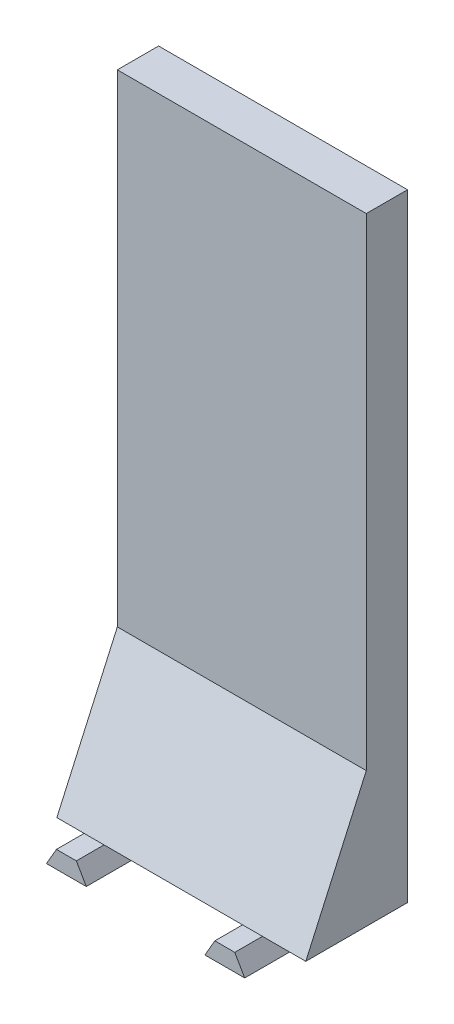
ISO-10303-21;
HEADER;
FILE_DESCRIPTION(('STEP AP214'),'2;1');
FILE_NAME('part.step','',(''),(''),'','','');
FILE_SCHEMA(('AUTOMOTIVE_DESIGN { 1 0 10303 214 1 1 1 1 }'));
ENDSEC;
DATA;
#1=APPLICATION_CONTEXT('core data for automotive mechanical design processes');
#2=APPLICATION_PROTOCOL_DEFINITION('international standard','automotive_design',2000,#1);
#3=PRODUCT_CONTEXT('',#1,'mechanical');
#4=PRODUCT('Part','Part','',(#3));
#5=PRODUCT_RELATED_PRODUCT_CATEGORY('part','',(#4));
#6=PRODUCT_DEFINITION_FORMATION('','',#4);
#7=PRODUCT_DEFINITION_CONTEXT('part definition',#1,'design');
#8=PRODUCT_DEFINITION('design','',#6,#7);
#9=PRODUCT_DEFINITION_SHAPE('','',#8);
#10=(LENGTH_UNIT() NAMED_UNIT(*) SI_UNIT(.MILLI.,.METRE.));
#11=(NAMED_UNIT(*) PLANE_ANGLE_UNIT() SI_UNIT($,.RADIAN.));
#12=(NAMED_UNIT(*) SI_UNIT($,.STERADIAN.) SOLID_ANGLE_UNIT());
#13=UNCERTAINTY_MEASURE_WITH_UNIT(LENGTH_MEASURE(1.E-05),#10,'distance_accuracy_value','');
#14=(GEOMETRIC_REPRESENTATION_CONTEXT(3) GLOBAL_UNCERTAINTY_ASSIGNED_CONTEXT((#13)) GLOBAL_UNIT_ASSIGNED_CONTEXT((#10,
#11,#12)) REPRESENTATION_CONTEXT('',''));
#15=CARTESIAN_POINT('',(0.,0.,0.));
#16=DIRECTION('',(0.,0.,1.));
#17=DIRECTION('',(1.,0.,0.));
#18=AXIS2_PLACEMENT_3D('',#15,#16,#17);
#19=CARTESIAN_POINT('',(694.20561018038,896.138718146704,5.));
#20=DIRECTION('',(0.,-1.,0.));
#21=DIRECTION('',(0.,0.,-1.));
#22=AXIS2_PLACEMENT_3D('',#19,#20,#21);
#23=PLANE('',#22);
#24=DIRECTION('',(1.,0.,0.));
#25=VECTOR('',#24,1.);
#26=CARTESIAN_POINT('',(694.20561018038,896.138718146704,20.));
#27=LINE('',#26,#25);
#28=CARTESIAN_POINT('',(694.20561018038,896.138718146704,20.));
#29=VERTEX_POINT('',#28);
#30=CARTESIAN_POINT('',(698.205610180381,896.138718146704,20.));
#31=VERTEX_POINT('',#30);
#32=EDGE_CURVE('E148',#29,#31,#27,.T.);
#33=ORIENTED_EDGE('',*,*,#32,.F.);
#34=DIRECTION('',(0.,0.,1.));
#35=VECTOR('',#34,1.);
#36=CARTESIAN_POINT('',(694.20561018038,896.138718146704,5.));
#37=LINE('',#36,#35);
#38=CARTESIAN_POINT('',(694.20561018038,896.138718146704,5.));
#39=VERTEX_POINT('',#38);
#40=EDGE_CURVE('E96',#39,#29,#37,.T.);
#41=ORIENTED_EDGE('',*,*,#40,.F.);
#42=DIRECTION('',(1.,0.,0.));
#43=VECTOR('',#42,1.);
#44=CARTESIAN_POINT('',(694.20561018038,896.138718146704,5.));
#45=LINE('',#44,#43);
#46=CARTESIAN_POINT('',(698.205610180381,896.138718146704,5.));
#47=VERTEX_POINT('',#46);
#48=EDGE_CURVE('E142',#39,#47,#45,.T.);
#49=ORIENTED_EDGE('',*,*,#48,.T.);
#50=DIRECTION('',(0.,0.,1.));
#51=VECTOR('',#50,1.);
#52=CARTESIAN_POINT('',(698.205610180381,896.138718146704,5.));
#53=LINE('',#52,#51);
#54=EDGE_CURVE('E76',#47,#31,#53,.T.);
#55=ORIENTED_EDGE('',*,*,#54,.T.);
#56=EDGE_LOOP('',(#33,#41,#49,#55));
#57=FACE_BOUND('',#56,.T.);
#58=ADVANCED_FACE('F52',(#57),#23,.T.);
#59=CARTESIAN_POINT('',(695.20561018038,897.870768954272,5.));
#60=DIRECTION('',(-0.866025403784439,0.499999999999998,0.));
#61=DIRECTION('',(-0.499999999999999,-0.86602540378444,0.));
#62=AXIS2_PLACEMENT_3D('',#59,#60,#61);
#63=PLANE('',#62);
#64=DIRECTION('',(0.499999999999999,0.86602540378444,0.));
#65=VECTOR('',#64,1.);
#66=CARTESIAN_POINT('',(695.20561018038,897.870768954272,7.));
#67=LINE('',#66,#65);
#68=CARTESIAN_POINT('',(695.200250037747,897.861484914896,7.));
#69=VERTEX_POINT('',#68);
#70=CARTESIAN_POINT('',(695.20561018038,897.870768954272,7.));
#71=VERTEX_POINT('',#70);
#72=EDGE_CURVE('E129',#69,#71,#67,.T.);
#73=ORIENTED_EDGE('',*,*,#72,.F.);
#74=DIRECTION('',(0.,0.,1.));
#75=VECTOR('',#74,1.);
#76=CARTESIAN_POINT('',(695.200250037747,897.861484914896,5.));
#77=LINE('',#76,#75);
#78=CARTESIAN_POINT('',(695.200250037747,897.861484914896,5.));
#79=VERTEX_POINT('',#78);
#80=EDGE_CURVE('E121',#79,#69,#77,.T.);
#81=ORIENTED_EDGE('',*,*,#80,.F.);
#82=DIRECTION('',(-0.499999999999998,-0.866025403784439,0.));
#83=VECTOR('',#82,1.);
#84=CARTESIAN_POINT('',(695.20561018038,897.870768954272,5.));
#85=LINE('',#84,#83);
#86=EDGE_CURVE('E132',#79,#39,#85,.T.);
#87=ORIENTED_EDGE('',*,*,#86,.T.);
#88=ORIENTED_EDGE('',*,*,#40,.T.);
#89=DIRECTION('',(-0.499999999999998,-0.866025403784439,0.));
#90=VECTOR('',#89,1.);
#91=CARTESIAN_POINT('',(695.20561018038,897.870768954272,20.));
#92=LINE('',#91,#90);
#93=CARTESIAN_POINT('',(695.20561018038,897.870768954272,20.));
#94=VERTEX_POINT('',#93);
#95=EDGE_CURVE('E138',#94,#29,#92,.T.);
#96=ORIENTED_EDGE('',*,*,#95,.F.);
#97=DIRECTION('',(0.,0.,1.));
#98=VECTOR('',#97,1.);
#99=CARTESIAN_POINT('',(695.20561018038,897.870768954272,5.));
#100=LINE('',#99,#98);
#101=EDGE_CURVE('E135',#71,#94,#100,.T.);
#102=ORIENTED_EDGE('',*,*,#101,.F.);
#103=EDGE_LOOP('',(#73,#81,#87,#88,#96,#102));
#104=FACE_BOUND('',#103,.T.);
#105=ADVANCED_FACE('F156',(#104),#63,.T.);
#106=CARTESIAN_POINT('',(697.20561018038,897.870768954272,5.));
#107=DIRECTION('',(0.,1.,0.));
#108=DIRECTION('',(0.,0.,1.));
#109=AXIS2_PLACEMENT_3D('',#106,#107,#108);
#110=PLANE('',#109);
#111=DIRECTION('',(1.,0.,0.));
#112=VECTOR('',#111,1.);
#113=CARTESIAN_POINT('',(697.20561018038,897.870768954272,7.));
#114=LINE('',#113,#112);
#115=CARTESIAN_POINT('',(697.20561018038,897.870768954272,7.));
#116=VERTEX_POINT('',#115);
#117=EDGE_CURVE('E117',#71,#116,#114,.T.);
#118=ORIENTED_EDGE('',*,*,#117,.F.);
#119=ORIENTED_EDGE('',*,*,#101,.T.);
#120=DIRECTION('',(-1.,0.,0.));
#121=VECTOR('',#120,1.);
#122=CARTESIAN_POINT('',(697.20561018038,897.870768954272,20.));
#123=LINE('',#122,#121);
#124=CARTESIAN_POINT('',(697.20561018038,897.870768954272,20.));
#125=VERTEX_POINT('',#124);
#126=EDGE_CURVE('E141',#125,#94,#123,.T.);
#127=ORIENTED_EDGE('',*,*,#126,.F.);
#128=DIRECTION('',(0.,0.,1.));
#129=VECTOR('',#128,1.);
#130=CARTESIAN_POINT('',(697.20561018038,897.870768954272,5.));
#131=LINE('',#130,#129);
#132=EDGE_CURVE('E133',#116,#125,#131,.T.);
#133=ORIENTED_EDGE('',*,*,#132,.F.);
#134=EDGE_LOOP('',(#118,#119,#127,#133));
#135=FACE_BOUND('',#134,.T.);
#136=ADVANCED_FACE('F159',(#135),#110,.T.);
#137=CARTESIAN_POINT('',(698.205610180381,896.138718146704,5.));
#138=DIRECTION('',(0.866025403784416,0.50000000000004,0.));
#139=DIRECTION('',(-0.50000000000004,0.866025403784416,0.));
#140=AXIS2_PLACEMENT_3D('',#137,#138,#139);
#141=PLANE('',#140);
#142=DIRECTION('',(0.50000000000004,-0.866025403784416,0.));
#143=VECTOR('',#142,1.);
#144=CARTESIAN_POINT('',(698.205610180381,896.138718146704,7.));
#145=LINE('',#144,#143);
#146=CARTESIAN_POINT('',(697.210970323013,897.861484914896,7.));
#147=VERTEX_POINT('',#146);
#148=EDGE_CURVE('E12',#116,#147,#145,.T.);
#149=ORIENTED_EDGE('',*,*,#148,.F.);
#150=ORIENTED_EDGE('',*,*,#132,.T.);
#151=DIRECTION('',(-0.50000000000004,0.866025403784415,0.));
#152=VECTOR('',#151,1.);
#153=CARTESIAN_POINT('',(698.205610180381,896.138718146704,20.));
#154=LINE('',#153,#152);
#155=EDGE_CURVE('E145',#31,#125,#154,.T.);
#156=ORIENTED_EDGE('',*,*,#155,.F.);
#157=ORIENTED_EDGE('',*,*,#54,.F.);
#158=DIRECTION('',(-0.50000000000004,0.866025403784415,0.));
#159=VECTOR('',#158,1.);
#160=CARTESIAN_POINT('',(698.205610180381,896.138718146704,5.));
#161=LINE('',#160,#159);
#162=CARTESIAN_POINT('',(697.210970323013,897.861484914896,5.));
#163=VERTEX_POINT('',#162);
#164=EDGE_CURVE('E124',#47,#163,#161,.T.);
#165=ORIENTED_EDGE('',*,*,#164,.T.);
#166=DIRECTION('',(0.,0.,-1.));
#167=VECTOR('',#166,1.);
#168=CARTESIAN_POINT('',(697.210970323013,897.861484914896,5.));
#169=LINE('',#168,#167);
#170=EDGE_CURVE('E67',#147,#163,#169,.T.);
#171=ORIENTED_EDGE('',*,*,#170,.F.);
#172=EDGE_LOOP('',(#149,#150,#156,#157,#165,#171));
#173=FACE_BOUND('',#172,.T.);
#174=ADVANCED_FACE('F123',(#173),#141,.T.);
#175=CARTESIAN_POINT('',(0.,0.,5.));
#176=DIRECTION('',(0.,0.,1.));
#177=DIRECTION('',(1.,0.,0.));
#178=AXIS2_PLACEMENT_3D('',#175,#176,#177);
#179=PLANE('',#178);
#180=ORIENTED_EDGE('',*,*,#86,.F.);
#181=DIRECTION('',(1.,0.,0.));
#182=VECTOR('',#181,1.);
#183=CARTESIAN_POINT('',(0.,897.861484914896,5.));
#184=LINE('',#183,#182);
#185=EDGE_CURVE('E60',#79,#163,#184,.T.);
#186=ORIENTED_EDGE('',*,*,#185,.T.);
#187=ORIENTED_EDGE('',*,*,#164,.F.);
#188=ORIENTED_EDGE('',*,*,#48,.F.);
#189=EDGE_LOOP('',(#180,#186,#187,#188));
#190=FACE_BOUND('',#189,.T.);
#191=ADVANCED_FACE('F54',(#190),#179,.F.);
#192=CARTESIAN_POINT('',(0.,0.,20.));
#193=DIRECTION('',(0.,0.,1.));
#194=DIRECTION('',(1.,0.,0.));
#195=AXIS2_PLACEMENT_3D('',#192,#193,#194);
#196=PLANE('',#195);
#197=ORIENTED_EDGE('',*,*,#32,.T.);
#198=ORIENTED_EDGE('',*,*,#155,.T.);
#199=ORIENTED_EDGE('',*,*,#126,.T.);
#200=ORIENTED_EDGE('',*,*,#95,.T.);
#201=EDGE_LOOP('',(#197,#198,#199,#200));
#202=FACE_BOUND('',#201,.T.);
#203=ADVANCED_FACE('F162',(#202),#196,.T.);
#204=CARTESIAN_POINT('',(701.556165530327,899.870768954272,7.));
#205=DIRECTION('',(0.,0.,1.));
#206=DIRECTION('',(1.,0.,0.));
#207=AXIS2_PLACEMENT_3D('',#204,#205,#206);
#208=PLANE('',#207);
#209=ORIENTED_EDGE('',*,*,#72,.T.);
#210=ORIENTED_EDGE('',*,*,#117,.T.);
#211=ORIENTED_EDGE('',*,*,#148,.T.);
#212=DIRECTION('',(-1.,0.,0.));
#213=VECTOR('',#212,1.);
#214=CARTESIAN_POINT('',(701.556165530327,897.861484914896,7.));
#215=LINE('',#214,#213);
#216=EDGE_CURVE('E114',#147,#69,#215,.T.);
#217=ORIENTED_EDGE('',*,*,#216,.T.);
#218=EDGE_LOOP('',(#209,#210,#211,#217));
#219=FACE_BOUND('',#218,.T.);
#220=ADVANCED_FACE('F113',(#219),#208,.F.);
#221=CARTESIAN_POINT('',(701.556165530327,897.861484914896,0.));
#222=DIRECTION('',(0.,-1.,0.));
#223=DIRECTION('',(0.,0.,-1.));
#224=AXIS2_PLACEMENT_3D('',#221,#222,#223);
#225=PLANE('',#224);
#226=ORIENTED_EDGE('',*,*,#80,.T.);
#227=ORIENTED_EDGE('',*,*,#216,.F.);
#228=ORIENTED_EDGE('',*,*,#170,.T.);
#229=ORIENTED_EDGE('',*,*,#185,.F.);
#230=EDGE_LOOP('',(#226,#227,#228,#229));
#231=FACE_BOUND('',#230,.T.);
#232=ADVANCED_FACE('F119',(#231),#225,.F.);
#233=CLOSED_SHELL('',(#58,#105,#136,#174,#191,#203,#220,#232));
#234=MANIFOLD_SOLID_BREP('B2',#233);
#235=CARTESIAN_POINT('',(681.296852934828,897.870768954272,5.));
#236=DIRECTION('',(0.,1.,0.));
#237=DIRECTION('',(0.,0.,1.));
#238=AXIS2_PLACEMENT_3D('',#235,#236,#237);
#239=PLANE('',#238);
#240=DIRECTION('',(1.,0.,0.));
#241=VECTOR('',#240,1.);
#242=CARTESIAN_POINT('',(681.296852934828,897.870768954272,7.));
#243=LINE('',#242,#241);
#244=CARTESIAN_POINT('',(679.296852934828,897.870768954272,7.));
#245=VERTEX_POINT('',#244);
#246=CARTESIAN_POINT('',(681.296852934828,897.870768954272,7.));
#247=VERTEX_POINT('',#246);
#248=EDGE_CURVE('E399',#245,#247,#243,.T.);
#249=ORIENTED_EDGE('',*,*,#248,.F.);
#250=DIRECTION('',(0.,0.,1.));
#251=VECTOR('',#250,1.);
#252=CARTESIAN_POINT('',(679.296852934828,897.870768954272,5.));
#253=LINE('',#252,#251);
#254=CARTESIAN_POINT('',(679.296852934828,897.870768954272,20.));
#255=VERTEX_POINT('',#254);
#256=EDGE_CURVE('E291',#245,#255,#253,.T.);
#257=ORIENTED_EDGE('',*,*,#256,.T.);
#258=DIRECTION('',(-1.,0.,0.));
#259=VECTOR('',#258,1.);
#260=CARTESIAN_POINT('',(681.296852934828,897.870768954272,20.));
#261=LINE('',#260,#259);
#262=CARTESIAN_POINT('',(681.296852934828,897.870768954272,20.));
#263=VERTEX_POINT('',#262);
#264=EDGE_CURVE('E289',#263,#255,#261,.T.);
#265=ORIENTED_EDGE('',*,*,#264,.F.);
#266=DIRECTION('',(0.,0.,1.));
#267=VECTOR('',#266,1.);
#268=CARTESIAN_POINT('',(681.296852934828,897.870768954272,5.));
#269=LINE('',#268,#267);
#270=EDGE_CURVE('E278',#247,#263,#269,.T.);
#271=ORIENTED_EDGE('',*,*,#270,.F.);
#272=EDGE_LOOP('',(#249,#257,#265,#271));
#273=FACE_BOUND('',#272,.T.);
#274=ADVANCED_FACE('F237',(#273),#239,.T.);
#275=CARTESIAN_POINT('',(682.296852934829,896.138718146704,5.));
#276=DIRECTION('',(0.866025403784416,0.50000000000004,0.));
#277=DIRECTION('',(-0.50000000000004,0.866025403784416,0.));
#278=AXIS2_PLACEMENT_3D('',#275,#276,#277);
#279=PLANE('',#278);
#280=DIRECTION('',(0.50000000000004,-0.866025403784416,0.));
#281=VECTOR('',#280,1.);
#282=CARTESIAN_POINT('',(682.296852934829,896.138718146704,7.));
#283=LINE('',#282,#281);
#284=CARTESIAN_POINT('',(681.302213077461,897.861484914896,7.));
#285=VERTEX_POINT('',#284);
#286=EDGE_CURVE('E284',#247,#285,#283,.T.);
#287=ORIENTED_EDGE('',*,*,#286,.F.);
#288=ORIENTED_EDGE('',*,*,#270,.T.);
#289=DIRECTION('',(-0.50000000000004,0.866025403784415,0.));
#290=VECTOR('',#289,1.);
#291=CARTESIAN_POINT('',(682.296852934829,896.138718146704,20.));
#292=LINE('',#291,#290);
#293=CARTESIAN_POINT('',(682.296852934829,896.138718146704,20.));
#294=VERTEX_POINT('',#293);
#295=EDGE_CURVE('E282',#294,#263,#292,.T.);
#296=ORIENTED_EDGE('',*,*,#295,.F.);
#297=DIRECTION('',(0.,0.,1.));
#298=VECTOR('',#297,1.);
#299=CARTESIAN_POINT('',(682.296852934829,896.138718146704,5.));
#300=LINE('',#299,#298);
#301=CARTESIAN_POINT('',(682.296852934829,896.138718146704,5.));
#302=VERTEX_POINT('',#301);
#303=EDGE_CURVE('E260',#302,#294,#300,.T.);
#304=ORIENTED_EDGE('',*,*,#303,.F.);
#305=DIRECTION('',(-0.50000000000004,0.866025403784415,0.));
#306=VECTOR('',#305,1.);
#307=CARTESIAN_POINT('',(682.296852934829,896.138718146704,5.));
#308=LINE('',#307,#306);
#309=CARTESIAN_POINT('',(681.302213077461,897.861484914896,5.));
#310=VERTEX_POINT('',#309);
#311=EDGE_CURVE('E311',#302,#310,#308,.T.);
#312=ORIENTED_EDGE('',*,*,#311,.T.);
#313=DIRECTION('',(0.,0.,-1.));
#314=VECTOR('',#313,1.);
#315=CARTESIAN_POINT('',(681.302213077461,897.861484914896,5.));
#316=LINE('',#315,#314);
#317=EDGE_CURVE('E251',#285,#310,#316,.T.);
#318=ORIENTED_EDGE('',*,*,#317,.F.);
#319=EDGE_LOOP('',(#287,#288,#296,#304,#312,#318));
#320=FACE_BOUND('',#319,.T.);
#321=ADVANCED_FACE('F280',(#320),#279,.T.);
#322=CARTESIAN_POINT('',(678.296852934829,896.138718146704,5.));
#323=DIRECTION('',(0.,-1.,0.));
#324=DIRECTION('',(0.,0.,-1.));
#325=AXIS2_PLACEMENT_3D('',#322,#323,#324);
#326=PLANE('',#325);
#327=DIRECTION('',(1.,0.,0.));
#328=VECTOR('',#327,1.);
#329=CARTESIAN_POINT('',(678.296852934829,896.138718146704,20.));
#330=LINE('',#329,#328);
#331=CARTESIAN_POINT('',(678.296852934829,896.138718146704,20.));
#332=VERTEX_POINT('',#331);
#333=EDGE_CURVE('E300',#332,#294,#330,.T.);
#334=ORIENTED_EDGE('',*,*,#333,.F.);
#335=DIRECTION('',(0.,0.,1.));
#336=VECTOR('',#335,1.);
#337=CARTESIAN_POINT('',(678.296852934829,896.138718146704,5.));
#338=LINE('',#337,#336);
#339=CARTESIAN_POINT('',(678.296852934829,896.138718146704,5.));
#340=VERTEX_POINT('',#339);
#341=EDGE_CURVE('E309',#340,#332,#338,.T.);
#342=ORIENTED_EDGE('',*,*,#341,.F.);
#343=DIRECTION('',(1.,0.,0.));
#344=VECTOR('',#343,1.);
#345=CARTESIAN_POINT('',(678.296852934829,896.138718146704,5.));
#346=LINE('',#345,#344);
#347=EDGE_CURVE('E303',#340,#302,#346,.T.);
#348=ORIENTED_EDGE('',*,*,#347,.T.);
#349=ORIENTED_EDGE('',*,*,#303,.T.);
#350=EDGE_LOOP('',(#334,#342,#348,#349));
#351=FACE_BOUND('',#350,.T.);
#352=ADVANCED_FACE('F329',(#351),#326,.T.);
#353=CARTESIAN_POINT('',(679.296852934828,897.870768954272,5.));
#354=DIRECTION('',(-0.866025403784463,0.499999999999957,0.));
#355=DIRECTION('',(-0.499999999999957,-0.866025403784464,0.));
#356=AXIS2_PLACEMENT_3D('',#353,#354,#355);
#357=PLANE('',#356);
#358=DIRECTION('',(0.499999999999957,0.866025403784464,0.));
#359=VECTOR('',#358,1.);
#360=CARTESIAN_POINT('',(679.296852934828,897.870768954272,7.));
#361=LINE('',#360,#359);
#362=CARTESIAN_POINT('',(679.291492792195,897.861484914896,7.));
#363=VERTEX_POINT('',#362);
#364=EDGE_CURVE('E50',#363,#245,#361,.T.);
#365=ORIENTED_EDGE('',*,*,#364,.F.);
#366=DIRECTION('',(0.,0.,1.));
#367=VECTOR('',#366,1.);
#368=CARTESIAN_POINT('',(679.291492792195,897.861484914896,5.));
#369=LINE('',#368,#367);
#370=CARTESIAN_POINT('',(679.291492792195,897.861484914896,5.));
#371=VERTEX_POINT('',#370);
#372=EDGE_CURVE('E402',#371,#363,#369,.T.);
#373=ORIENTED_EDGE('',*,*,#372,.F.);
#374=DIRECTION('',(-0.499999999999957,-0.866025403784464,0.));
#375=VECTOR('',#374,1.);
#376=CARTESIAN_POINT('',(679.296852934828,897.870768954272,5.));
#377=LINE('',#376,#375);
#378=EDGE_CURVE('E301',#371,#340,#377,.T.);
#379=ORIENTED_EDGE('',*,*,#378,.T.);
#380=ORIENTED_EDGE('',*,*,#341,.T.);
#381=DIRECTION('',(-0.499999999999957,-0.866025403784464,0.));
#382=VECTOR('',#381,1.);
#383=CARTESIAN_POINT('',(679.296852934828,897.870768954272,20.));
#384=LINE('',#383,#382);
#385=EDGE_CURVE('E295',#255,#332,#384,.T.);
#386=ORIENTED_EDGE('',*,*,#385,.F.);
#387=ORIENTED_EDGE('',*,*,#256,.F.);
#388=EDGE_LOOP('',(#365,#373,#379,#380,#386,#387));
#389=FACE_BOUND('',#388,.T.);
#390=ADVANCED_FACE('F325',(#389),#357,.T.);
#391=CARTESIAN_POINT('',(0.,0.,5.));
#392=DIRECTION('',(0.,0.,1.));
#393=DIRECTION('',(1.,0.,0.));
#394=AXIS2_PLACEMENT_3D('',#391,#392,#393);
#395=PLANE('',#394);
#396=ORIENTED_EDGE('',*,*,#378,.F.);
#397=DIRECTION('',(1.,0.,0.));
#398=VECTOR('',#397,1.);
#399=CARTESIAN_POINT('',(0.,897.861484914896,5.));
#400=LINE('',#399,#398);
#401=EDGE_CURVE('E244',#371,#310,#400,.T.);
#402=ORIENTED_EDGE('',*,*,#401,.T.);
#403=ORIENTED_EDGE('',*,*,#311,.F.);
#404=ORIENTED_EDGE('',*,*,#347,.F.);
#405=EDGE_LOOP('',(#396,#402,#403,#404));
#406=FACE_BOUND('',#405,.T.);
#407=ADVANCED_FACE('F315',(#406),#395,.F.);
#408=CARTESIAN_POINT('',(0.,0.,20.));
#409=DIRECTION('',(0.,0.,1.));
#410=DIRECTION('',(1.,0.,0.));
#411=AXIS2_PLACEMENT_3D('',#408,#409,#410);
#412=PLANE('',#411);
#413=ORIENTED_EDGE('',*,*,#264,.T.);
#414=ORIENTED_EDGE('',*,*,#385,.T.);
#415=ORIENTED_EDGE('',*,*,#333,.T.);
#416=ORIENTED_EDGE('',*,*,#295,.T.);
#417=EDGE_LOOP('',(#413,#414,#415,#416));
#418=FACE_BOUND('',#417,.T.);
#419=ADVANCED_FACE('F298',(#418),#412,.T.);
#420=CARTESIAN_POINT('',(701.556165530327,899.870768954272,7.));
#421=DIRECTION('',(0.,0.,1.));
#422=DIRECTION('',(1.,0.,0.));
#423=AXIS2_PLACEMENT_3D('',#420,#421,#422);
#424=PLANE('',#423);
#425=ORIENTED_EDGE('',*,*,#286,.T.);
#426=DIRECTION('',(-1.,0.,0.));
#427=VECTOR('',#426,1.);
#428=CARTESIAN_POINT('',(701.556165530327,897.861484914896,7.));
#429=LINE('',#428,#427);
#430=EDGE_CURVE('E398',#285,#363,#429,.T.);
#431=ORIENTED_EDGE('',*,*,#430,.T.);
#432=ORIENTED_EDGE('',*,*,#364,.T.);
#433=ORIENTED_EDGE('',*,*,#248,.T.);
#434=EDGE_LOOP('',(#425,#431,#432,#433));
#435=FACE_BOUND('',#434,.T.);
#436=ADVANCED_FACE('F364',(#435),#424,.F.);
#437=CARTESIAN_POINT('',(701.556165530327,897.861484914896,0.));
#438=DIRECTION('',(0.,-1.,0.));
#439=DIRECTION('',(0.,0.,-1.));
#440=AXIS2_PLACEMENT_3D('',#437,#438,#439);
#441=PLANE('',#440);
#442=ORIENTED_EDGE('',*,*,#317,.T.);
#443=ORIENTED_EDGE('',*,*,#401,.F.);
#444=ORIENTED_EDGE('',*,*,#372,.T.);
#445=ORIENTED_EDGE('',*,*,#430,.F.);
#446=EDGE_LOOP('',(#442,#443,#444,#445));
#447=FACE_BOUND('',#446,.T.);
#448=ADVANCED_FACE('F368',(#447),#441,.F.);
#449=CLOSED_SHELL('',(#274,#321,#352,#390,#407,#419,#436,#448));
#450=MANIFOLD_SOLID_BREP('B6',#449);
#451=CARTESIAN_POINT('',(676.556165530327,959.870768954273,7.));
#452=DIRECTION('',(0.,0.,1.));
#453=DIRECTION('',(1.,0.,0.));
#454=AXIS2_PLACEMENT_3D('',#451,#452,#453);
#455=PLANE('',#454);
#456=DIRECTION('',(0.,-1.,0.));
#457=VECTOR('',#456,1.);
#458=CARTESIAN_POINT('',(701.556165530327,959.870768954273,7.));
#459=LINE('',#458,#457);
#460=CARTESIAN_POINT('',(701.556165530327,959.870768954273,7.));
#461=VERTEX_POINT('',#460);
#462=CARTESIAN_POINT('',(701.556165530327,897.870768954272,7.));
#463=VERTEX_POINT('',#462);
#464=EDGE_CURVE('E540',#461,#463,#459,.T.);
#465=ORIENTED_EDGE('',*,*,#464,.T.);
#466=DIRECTION('',(1.,0.,0.));
#467=VECTOR('',#466,1.);
#468=CARTESIAN_POINT('',(676.556165530327,897.870768954272,7.));
#469=LINE('',#468,#467);
#470=CARTESIAN_POINT('',(676.556165530327,897.870768954272,7.));
#471=VERTEX_POINT('',#470);
#472=EDGE_CURVE('E505',#471,#463,#469,.T.);
#473=ORIENTED_EDGE('',*,*,#472,.F.);
#474=DIRECTION('',(0.,-1.,0.));
#475=VECTOR('',#474,1.);
#476=CARTESIAN_POINT('',(676.556165530327,959.870768954273,7.));
#477=LINE('',#476,#475);
#478=CARTESIAN_POINT('',(676.556165530327,959.870768954273,7.));
#479=VERTEX_POINT('',#478);
#480=EDGE_CURVE('E538',#479,#471,#477,.T.);
#481=ORIENTED_EDGE('',*,*,#480,.F.);
#482=DIRECTION('',(-1.,0.,0.));
#483=VECTOR('',#482,1.);
#484=CARTESIAN_POINT('',(676.556165530327,959.870768954273,7.));
#485=LINE('',#484,#483);
#486=EDGE_CURVE('E536',#461,#479,#485,.T.);
#487=ORIENTED_EDGE('',*,*,#486,.F.);
#488=EDGE_LOOP('',(#465,#473,#481,#487));
#489=FACE_BOUND('',#488,.T.);
#490=DIRECTION('',(0.,1.,0.));
#491=VECTOR('',#490,1.);
#492=CARTESIAN_POINT('',(686.556165530327,899.769587872202,7.));
#493=LINE('',#492,#491);
#494=CARTESIAN_POINT('',(686.556165530327,899.769587872202,7.));
#495=VERTEX_POINT('',#494);
#496=CARTESIAN_POINT('',(686.556165530327,903.769587872202,7.));
#497=VERTEX_POINT('',#496);
#498=EDGE_CURVE('E504',#495,#497,#493,.T.);
#499=ORIENTED_EDGE('',*,*,#498,.F.);
#500=DIRECTION('',(-1.,0.,0.));
#501=VECTOR('',#500,1.);
#502=CARTESIAN_POINT('',(691.556165530327,899.769587872202,7.));
#503=LINE('',#502,#501);
#504=CARTESIAN_POINT('',(691.556165530327,899.769587872202,7.));
#505=VERTEX_POINT('',#504);
#506=EDGE_CURVE('E501',#505,#495,#503,.T.);
#507=ORIENTED_EDGE('',*,*,#506,.F.);
#508=DIRECTION('',(0.,-1.,0.));
#509=VECTOR('',#508,1.);
#510=CARTESIAN_POINT('',(691.556165530327,903.769587872202,7.));
#511=LINE('',#510,#509);
#512=CARTESIAN_POINT('',(691.556165530327,903.769587872202,7.));
#513=VERTEX_POINT('',#512);
#514=EDGE_CURVE('E433',#513,#505,#511,.T.);
#515=ORIENTED_EDGE('',*,*,#514,.F.);
#516=DIRECTION('',(1.,0.,0.));
#517=VECTOR('',#516,1.);
#518=CARTESIAN_POINT('',(686.556165530327,903.769587872202,7.));
#519=LINE('',#518,#517);
#520=EDGE_CURVE('E428',#497,#513,#519,.T.);
#521=ORIENTED_EDGE('',*,*,#520,.F.);
#522=EDGE_LOOP('',(#499,#507,#515,#521));
#523=FACE_BOUND('',#522,.T.);
#524=ADVANCED_FACE('F413',(#489,#523),#455,.F.);
#525=CARTESIAN_POINT('',(676.556165530327,897.870768954272,20.));
#526=DIRECTION('',(1.,0.,0.));
#527=DIRECTION('',(0.,0.,-1.));
#528=AXIS2_PLACEMENT_3D('',#525,#526,#527);
#529=PLANE('',#528);
#530=ORIENTED_EDGE('',*,*,#480,.T.);
#531=DIRECTION('',(0.,0.,-1.));
#532=VECTOR('',#531,1.);
#533=CARTESIAN_POINT('',(676.556165530327,897.870768954272,20.));
#534=LINE('',#533,#532);
#535=CARTESIAN_POINT('',(676.556165530327,897.870768954272,17.2174182769731));
#536=VERTEX_POINT('',#535);
#537=EDGE_CURVE('E235',#536,#471,#534,.T.);
#538=ORIENTED_EDGE('',*,*,#537,.F.);
#539=DIRECTION('',(0.,-0.912507324151505,0.409060366412905));
#540=VECTOR('',#539,1.);
#541=CARTESIAN_POINT('',(676.556165530327,897.870768954272,17.2174182769731));
#542=LINE('',#541,#540);
#543=CARTESIAN_POINT('',(676.556165530327,911.420968004325,11.1431115380804));
#544=VERTEX_POINT('',#543);
#545=EDGE_CURVE('E518',#544,#536,#542,.T.);
#546=ORIENTED_EDGE('',*,*,#545,.F.);
#547=DIRECTION('',(0.,-1.,0.));
#548=VECTOR('',#547,1.);
#549=CARTESIAN_POINT('',(676.556165530327,911.420968004325,11.1431115380804));
#550=LINE('',#549,#548);
#551=CARTESIAN_POINT('',(676.556165530327,959.870768954273,11.1431115380804));
#552=VERTEX_POINT('',#551);
#553=EDGE_CURVE('E508',#552,#544,#550,.T.);
#554=ORIENTED_EDGE('',*,*,#553,.F.);
#555=DIRECTION('',(0.,0.,1.));
#556=VECTOR('',#555,1.);
#557=CARTESIAN_POINT('',(676.556165530327,959.870768954273,7.));
#558=LINE('',#557,#556);
#559=EDGE_CURVE('E528',#479,#552,#558,.T.);
#560=ORIENTED_EDGE('',*,*,#559,.F.);
#561=EDGE_LOOP('',(#530,#538,#546,#554,#560));
#562=FACE_BOUND('',#561,.T.);
#563=ADVANCED_FACE('F415',(#562),#529,.F.);
#564=CARTESIAN_POINT('',(676.556165530327,897.870768954272,20.));
#565=DIRECTION('',(0.,1.,0.));
#566=DIRECTION('',(0.,0.,1.));
#567=AXIS2_PLACEMENT_3D('',#564,#565,#566);
#568=PLANE('',#567);
#569=ORIENTED_EDGE('',*,*,#537,.T.);
#570=ORIENTED_EDGE('',*,*,#472,.T.);
#571=DIRECTION('',(0.,0.,-1.));
#572=VECTOR('',#571,1.);
#573=CARTESIAN_POINT('',(701.556165530327,897.870768954272,20.));
#574=LINE('',#573,#572);
#575=CARTESIAN_POINT('',(701.556165530327,897.870768954272,17.2174182769731));
#576=VERTEX_POINT('',#575);
#577=EDGE_CURVE('E421',#576,#463,#574,.T.);
#578=ORIENTED_EDGE('',*,*,#577,.F.);
#579=DIRECTION('',(-1.,0.,0.));
#580=VECTOR('',#579,1.);
#581=CARTESIAN_POINT('',(701.556165530327,897.870768954272,17.2174182769731));
#582=LINE('',#581,#580);
#583=EDGE_CURVE('E525',#576,#536,#582,.T.);
#584=ORIENTED_EDGE('',*,*,#583,.T.);
#585=EDGE_LOOP('',(#569,#570,#578,#584));
#586=FACE_BOUND('',#585,.T.);
#587=ADVANCED_FACE('F550',(#586),#568,.F.);
#588=CARTESIAN_POINT('',(701.556165530327,897.870768954272,20.));
#589=DIRECTION('',(-1.,0.,0.));
#590=DIRECTION('',(0.,0.,1.));
#591=AXIS2_PLACEMENT_3D('',#588,#589,#590);
#592=PLANE('',#591);
#593=ORIENTED_EDGE('',*,*,#577,.T.);
#594=ORIENTED_EDGE('',*,*,#464,.F.);
#595=DIRECTION('',(0.,0.,-1.));
#596=VECTOR('',#595,1.);
#597=CARTESIAN_POINT('',(701.556165530327,959.870768954273,7.));
#598=LINE('',#597,#596);
#599=CARTESIAN_POINT('',(701.556165530327,959.870768954273,11.1431115380804));
#600=VERTEX_POINT('',#599);
#601=EDGE_CURVE('E534',#600,#461,#598,.T.);
#602=ORIENTED_EDGE('',*,*,#601,.F.);
#603=DIRECTION('',(0.,-1.,0.));
#604=VECTOR('',#603,1.);
#605=CARTESIAN_POINT('',(701.556165530327,911.420968004325,11.1431115380804));
#606=LINE('',#605,#604);
#607=CARTESIAN_POINT('',(701.556165530327,911.420968004325,11.1431115380804));
#608=VERTEX_POINT('',#607);
#609=EDGE_CURVE('E514',#600,#608,#606,.T.);
#610=ORIENTED_EDGE('',*,*,#609,.T.);
#611=DIRECTION('',(0.,-0.912507324151505,0.409060366412905));
#612=VECTOR('',#611,1.);
#613=CARTESIAN_POINT('',(701.556165530327,897.870768954272,17.2174182769731));
#614=LINE('',#613,#612);
#615=EDGE_CURVE('E517',#608,#576,#614,.T.);
#616=ORIENTED_EDGE('',*,*,#615,.T.);
#617=EDGE_LOOP('',(#593,#594,#602,#610,#616));
#618=FACE_BOUND('',#617,.T.);
#619=ADVANCED_FACE('F545',(#618),#592,.F.);
#620=CARTESIAN_POINT('',(0.,959.870768954273,0.));
#621=DIRECTION('',(0.,1.,0.));
#622=DIRECTION('',(0.,0.,1.));
#623=AXIS2_PLACEMENT_3D('',#620,#621,#622);
#624=PLANE('',#623);
#625=DIRECTION('',(-1.,0.,0.));
#626=VECTOR('',#625,1.);
#627=CARTESIAN_POINT('',(701.556165530327,959.870768954273,11.1431115380804));
#628=LINE('',#627,#626);
#629=EDGE_CURVE('E521',#600,#552,#628,.T.);
#630=ORIENTED_EDGE('',*,*,#629,.F.);
#631=ORIENTED_EDGE('',*,*,#601,.T.);
#632=ORIENTED_EDGE('',*,*,#486,.T.);
#633=ORIENTED_EDGE('',*,*,#559,.T.);
#634=EDGE_LOOP('',(#630,#631,#632,#633));
#635=FACE_BOUND('',#634,.T.);
#636=ADVANCED_FACE('F558',(#635),#624,.T.);
#637=CARTESIAN_POINT('',(701.556165530327,897.870768954272,17.2174182769731));
#638=DIRECTION('',(0.,-0.409060366412905,-0.912507324151505));
#639=DIRECTION('',(0.,0.912507324151505,-0.409060366412905));
#640=AXIS2_PLACEMENT_3D('',#637,#638,#639);
#641=PLANE('',#640);
#642=ORIENTED_EDGE('',*,*,#545,.T.);
#643=ORIENTED_EDGE('',*,*,#583,.F.);
#644=ORIENTED_EDGE('',*,*,#615,.F.);
#645=DIRECTION('',(-1.,0.,0.));
#646=VECTOR('',#645,1.);
#647=CARTESIAN_POINT('',(701.556165530327,911.420968004325,11.1431115380804));
#648=LINE('',#647,#646);
#649=EDGE_CURVE('E529',#608,#544,#648,.T.);
#650=ORIENTED_EDGE('',*,*,#649,.T.);
#651=EDGE_LOOP('',(#642,#643,#644,#650));
#652=FACE_BOUND('',#651,.T.);
#653=ADVANCED_FACE('F564',(#652),#641,.F.);
#654=CARTESIAN_POINT('',(701.556165530327,911.420968004325,11.1431115380804));
#655=DIRECTION('',(0.,0.,-1.));
#656=DIRECTION('',(-1.,0.,0.));
#657=AXIS2_PLACEMENT_3D('',#654,#655,#656);
#658=PLANE('',#657);
#659=ORIENTED_EDGE('',*,*,#553,.T.);
#660=ORIENTED_EDGE('',*,*,#649,.F.);
#661=ORIENTED_EDGE('',*,*,#609,.F.);
#662=ORIENTED_EDGE('',*,*,#629,.T.);
#663=EDGE_LOOP('',(#659,#660,#661,#662));
#664=FACE_BOUND('',#663,.T.);
#665=ADVANCED_FACE('F560',(#664),#658,.F.);
#666=CARTESIAN_POINT('',(686.556165530327,899.769587872202,1.));
#667=DIRECTION('',(1.,0.,0.));
#668=DIRECTION('',(0.,0.,-1.));
#669=AXIS2_PLACEMENT_3D('',#666,#667,#668);
#670=PLANE('',#669);
#671=ORIENTED_EDGE('',*,*,#498,.T.);
#672=DIRECTION('',(0.,0.,1.));
#673=VECTOR('',#672,1.);
#674=CARTESIAN_POINT('',(686.556165530327,903.769587872202,1.));
#675=LINE('',#674,#673);
#676=CARTESIAN_POINT('',(686.556165530327,903.769587872202,1.));
#677=VERTEX_POINT('',#676);
#678=EDGE_CURVE('E485',#677,#497,#675,.T.);
#679=ORIENTED_EDGE('',*,*,#678,.F.);
#680=DIRECTION('',(0.,1.,0.));
#681=VECTOR('',#680,1.);
#682=CARTESIAN_POINT('',(686.556165530327,899.769587872202,1.));
#683=LINE('',#682,#681);
#684=CARTESIAN_POINT('',(686.556165530327,899.769587872202,1.));
#685=VERTEX_POINT('',#684);
#686=EDGE_CURVE('E492',#685,#677,#683,.T.);
#687=ORIENTED_EDGE('',*,*,#686,.F.);
#688=DIRECTION('',(0.,0.,1.));
#689=VECTOR('',#688,1.);
#690=CARTESIAN_POINT('',(686.556165530327,899.769587872202,1.));
#691=LINE('',#690,#689);
#692=EDGE_CURVE('E621',#685,#495,#691,.T.);
#693=ORIENTED_EDGE('',*,*,#692,.T.);
#694=EDGE_LOOP('',(#671,#679,#687,#693));
#695=FACE_BOUND('',#694,.T.);
#696=ADVANCED_FACE('F503',(#695),#670,.F.);
#697=CARTESIAN_POINT('',(686.556165530327,903.769587872202,1.));
#698=DIRECTION('',(0.,-1.,0.));
#699=DIRECTION('',(0.,0.,-1.));
#700=AXIS2_PLACEMENT_3D('',#697,#698,#699);
#701=PLANE('',#700);
#702=CARTESIAN_POINT('',(689.056165530327,903.769587872202,3.5));
#703=DIRECTION('',(0.,1.,0.));
#704=DIRECTION('',(0.,0.,1.));
#705=AXIS2_PLACEMENT_3D('',#702,#703,#704);
#706=CIRCLE('',#705,1.24999999999997);
#707=CARTESIAN_POINT('',(689.056165530327,903.769587872202,4.74999999999998));
#708=VERTEX_POINT('',#707);
#709=EDGE_CURVE('E612',#708,#708,#706,.T.);
#710=ORIENTED_EDGE('',*,*,#709,.F.);
#711=EDGE_LOOP('',(#710));
#712=FACE_BOUND('',#711,.T.);
#713=ORIENTED_EDGE('',*,*,#520,.T.);
#714=DIRECTION('',(0.,0.,1.));
#715=VECTOR('',#714,1.);
#716=CARTESIAN_POINT('',(691.556165530327,903.769587872202,1.));
#717=LINE('',#716,#715);
#718=CARTESIAN_POINT('',(691.556165530327,903.769587872202,1.));
#719=VERTEX_POINT('',#718);
#720=EDGE_CURVE('E488',#719,#513,#717,.T.);
#721=ORIENTED_EDGE('',*,*,#720,.F.);
#722=DIRECTION('',(1.,0.,0.));
#723=VECTOR('',#722,1.);
#724=CARTESIAN_POINT('',(686.556165530327,903.769587872202,1.));
#725=LINE('',#724,#723);
#726=EDGE_CURVE('E481',#677,#719,#725,.T.);
#727=ORIENTED_EDGE('',*,*,#726,.F.);
#728=ORIENTED_EDGE('',*,*,#678,.T.);
#729=EDGE_LOOP('',(#713,#721,#727,#728));
#730=FACE_BOUND('',#729,.T.);
#731=ADVANCED_FACE('F483',(#712,#730),#701,.F.);
#732=CARTESIAN_POINT('',(691.556165530327,903.769587872202,1.));
#733=DIRECTION('',(-1.,0.,0.));
#734=DIRECTION('',(0.,0.,1.));
#735=AXIS2_PLACEMENT_3D('',#732,#733,#734);
#736=PLANE('',#735);
#737=ORIENTED_EDGE('',*,*,#514,.T.);
#738=DIRECTION('',(0.,0.,1.));
#739=VECTOR('',#738,1.);
#740=CARTESIAN_POINT('',(691.556165530327,899.769587872202,1.));
#741=LINE('',#740,#739);
#742=CARTESIAN_POINT('',(691.556165530327,899.769587872202,1.));
#743=VERTEX_POINT('',#742);
#744=EDGE_CURVE('E510',#743,#505,#741,.T.);
#745=ORIENTED_EDGE('',*,*,#744,.F.);
#746=DIRECTION('',(0.,-1.,0.));
#747=VECTOR('',#746,1.);
#748=CARTESIAN_POINT('',(691.556165530327,903.769587872202,1.));
#749=LINE('',#748,#747);
#750=EDGE_CURVE('E491',#719,#743,#749,.T.);
#751=ORIENTED_EDGE('',*,*,#750,.F.);
#752=ORIENTED_EDGE('',*,*,#720,.T.);
#753=EDGE_LOOP('',(#737,#745,#751,#752));
#754=FACE_BOUND('',#753,.T.);
#755=ADVANCED_FACE('F593',(#754),#736,.F.);
#756=CARTESIAN_POINT('',(691.556165530327,899.769587872202,1.));
#757=DIRECTION('',(0.,1.,0.));
#758=DIRECTION('',(0.,0.,1.));
#759=AXIS2_PLACEMENT_3D('',#756,#757,#758);
#760=PLANE('',#759);
#761=CARTESIAN_POINT('',(689.056165530327,899.769587872202,3.5));
#762=DIRECTION('',(0.,1.,0.));
#763=DIRECTION('',(0.,0.,1.));
#764=AXIS2_PLACEMENT_3D('',#761,#762,#763);
#765=CIRCLE('',#764,1.24999999999997);
#766=CARTESIAN_POINT('',(689.056165530327,899.769587872202,4.74999999999998));
#767=VERTEX_POINT('',#766);
#768=EDGE_CURVE('E615',#767,#767,#765,.T.);
#769=ORIENTED_EDGE('',*,*,#768,.T.);
#770=EDGE_LOOP('',(#769));
#771=FACE_BOUND('',#770,.T.);
#772=ORIENTED_EDGE('',*,*,#506,.T.);
#773=ORIENTED_EDGE('',*,*,#692,.F.);
#774=DIRECTION('',(-1.,0.,0.));
#775=VECTOR('',#774,1.);
#776=CARTESIAN_POINT('',(691.556165530327,899.769587872202,1.));
#777=LINE('',#776,#775);
#778=EDGE_CURVE('E497',#743,#685,#777,.T.);
#779=ORIENTED_EDGE('',*,*,#778,.F.);
#780=ORIENTED_EDGE('',*,*,#744,.T.);
#781=EDGE_LOOP('',(#772,#773,#779,#780));
#782=FACE_BOUND('',#781,.T.);
#783=ADVANCED_FACE('F597',(#771,#782),#760,.F.);
#784=CARTESIAN_POINT('',(0.,0.,1.));
#785=DIRECTION('',(0.,0.,-1.));
#786=DIRECTION('',(-1.,0.,0.));
#787=AXIS2_PLACEMENT_3D('',#784,#785,#786);
#788=PLANE('',#787);
#789=ORIENTED_EDGE('',*,*,#686,.T.);
#790=ORIENTED_EDGE('',*,*,#726,.T.);
#791=ORIENTED_EDGE('',*,*,#750,.T.);
#792=ORIENTED_EDGE('',*,*,#778,.T.);
#793=EDGE_LOOP('',(#789,#790,#791,#792));
#794=FACE_BOUND('',#793,.T.);
#795=ADVANCED_FACE('F495',(#794),#788,.T.);
#796=CARTESIAN_POINT('',(689.056165530327,903.769587872202,3.5));
#797=DIRECTION('',(0.,1.,0.));
#798=DIRECTION('',(0.,0.,1.));
#799=AXIS2_PLACEMENT_3D('',#796,#797,#798);
#800=CYLINDRICAL_SURFACE('',#799,1.24999999999997);
#801=ORIENTED_EDGE('',*,*,#709,.T.);
#802=EDGE_LOOP('',(#801));
#803=FACE_BOUND('',#802,.T.);
#804=ORIENTED_EDGE('',*,*,#768,.F.);
#805=EDGE_LOOP('',(#804));
#806=FACE_BOUND('',#805,.T.);
#807=ADVANCED_FACE('F604',(#803,#806),#800,.F.);
#808=CLOSED_SHELL('',(#524,#563,#587,#619,#636,#653,#665,#696,#731,#755,#783,#795,#807));
#809=MANIFOLD_SOLID_BREP('B44',#808);
#810=ADVANCED_BREP_SHAPE_REPRESENTATION('',(#18,#234,#450,#809),#14);
#811=SHAPE_DEFINITION_REPRESENTATION(#9,#810);
ENDSEC;
END-ISO-10303-21;
